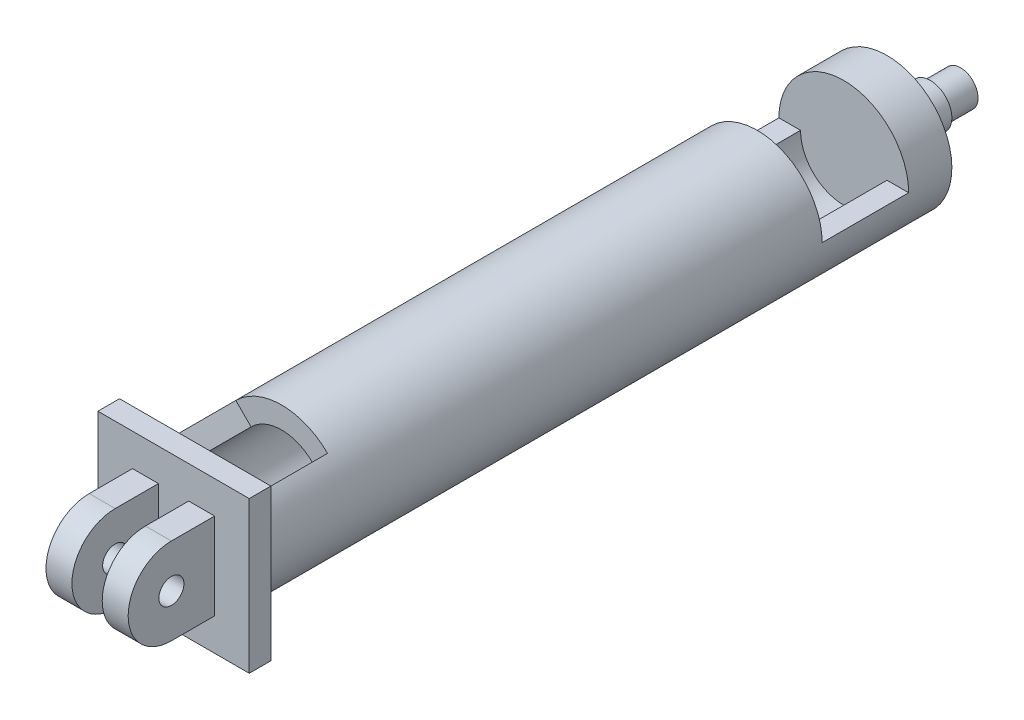
ISO-10303-21;
HEADER;
FILE_DESCRIPTION(('STEP AP214'),'2;1');
FILE_NAME('part.step','',(''),(''),'','','');
FILE_SCHEMA(('AUTOMOTIVE_DESIGN { 1 0 10303 214 1 1 1 1 }'));
ENDSEC;
DATA;
#1=APPLICATION_CONTEXT('core data for automotive mechanical design processes');
#2=APPLICATION_PROTOCOL_DEFINITION('international standard','automotive_design',2000,#1);
#3=PRODUCT_CONTEXT('',#1,'mechanical');
#4=PRODUCT('Part','Part','',(#3));
#5=PRODUCT_RELATED_PRODUCT_CATEGORY('part','',(#4));
#6=PRODUCT_DEFINITION_FORMATION('','',#4);
#7=PRODUCT_DEFINITION_CONTEXT('part definition',#1,'design');
#8=PRODUCT_DEFINITION('design','',#6,#7);
#9=PRODUCT_DEFINITION_SHAPE('','',#8);
#10=(LENGTH_UNIT() NAMED_UNIT(*) SI_UNIT(.MILLI.,.METRE.));
#11=(NAMED_UNIT(*) PLANE_ANGLE_UNIT() SI_UNIT($,.RADIAN.));
#12=(NAMED_UNIT(*) SI_UNIT($,.STERADIAN.) SOLID_ANGLE_UNIT());
#13=UNCERTAINTY_MEASURE_WITH_UNIT(LENGTH_MEASURE(1.E-05),#10,'distance_accuracy_value','');
#14=(GEOMETRIC_REPRESENTATION_CONTEXT(3) GLOBAL_UNCERTAINTY_ASSIGNED_CONTEXT((#13)) GLOBAL_UNIT_ASSIGNED_CONTEXT((#10,
#11,#12)) REPRESENTATION_CONTEXT('',''));
#15=CARTESIAN_POINT('',(0.,0.,0.));
#16=DIRECTION('',(0.,0.,1.));
#17=DIRECTION('',(1.,0.,0.));
#18=AXIS2_PLACEMENT_3D('',#15,#16,#17);
#19=CARTESIAN_POINT('',(17.5,-17.5,155.));
#20=DIRECTION('',(-1.,0.,0.));
#21=DIRECTION('',(0.,0.,1.));
#22=AXIS2_PLACEMENT_3D('',#19,#20,#21);
#23=PLANE('',#22);
#24=DIRECTION('',(0.,0.,-1.));
#25=VECTOR('',#24,1.);
#26=CARTESIAN_POINT('',(17.5,17.5,155.));
#27=LINE('',#26,#25);
#28=CARTESIAN_POINT('',(17.5,17.5,155.));
#29=VERTEX_POINT('',#28);
#30=CARTESIAN_POINT('',(17.5,17.5,150.));
#31=VERTEX_POINT('',#30);
#32=EDGE_CURVE('E487',#29,#31,#27,.T.);
#33=ORIENTED_EDGE('',*,*,#32,.F.);
#34=DIRECTION('',(0.,1.,0.));
#35=VECTOR('',#34,1.);
#36=CARTESIAN_POINT('',(17.5,-17.5,155.));
#37=LINE('',#36,#35);
#38=CARTESIAN_POINT('',(17.5,-17.5,155.));
#39=VERTEX_POINT('',#38);
#40=EDGE_CURVE('E451',#39,#29,#37,.T.);
#41=ORIENTED_EDGE('',*,*,#40,.F.);
#42=DIRECTION('',(0.,0.,-1.));
#43=VECTOR('',#42,1.);
#44=CARTESIAN_POINT('',(17.5,-17.5,155.));
#45=LINE('',#44,#43);
#46=CARTESIAN_POINT('',(17.5,-17.5,150.));
#47=VERTEX_POINT('',#46);
#48=EDGE_CURVE('E464',#39,#47,#45,.T.);
#49=ORIENTED_EDGE('',*,*,#48,.T.);
#50=DIRECTION('',(0.,1.,0.));
#51=VECTOR('',#50,1.);
#52=CARTESIAN_POINT('',(17.5,-17.5,150.));
#53=LINE('',#52,#51);
#54=EDGE_CURVE('E440',#47,#31,#53,.T.);
#55=ORIENTED_EDGE('',*,*,#54,.T.);
#56=EDGE_LOOP('',(#33,#41,#49,#55));
#57=FACE_BOUND('',#56,.T.);
#58=ADVANCED_FACE('F45',(#57),#23,.F.);
#59=CARTESIAN_POINT('',(-17.5,-17.5,155.));
#60=DIRECTION('',(1.,0.,0.));
#61=DIRECTION('',(0.,0.,-1.));
#62=AXIS2_PLACEMENT_3D('',#59,#60,#61);
#63=PLANE('',#62);
#64=DIRECTION('',(0.,0.,-1.));
#65=VECTOR('',#64,1.);
#66=CARTESIAN_POINT('',(-17.5,-17.5,155.));
#67=LINE('',#66,#65);
#68=CARTESIAN_POINT('',(-17.5,-17.5,155.));
#69=VERTEX_POINT('',#68);
#70=CARTESIAN_POINT('',(-17.5,-17.5,150.));
#71=VERTEX_POINT('',#70);
#72=EDGE_CURVE('E479',#69,#71,#67,.T.);
#73=ORIENTED_EDGE('',*,*,#72,.F.);
#74=DIRECTION('',(0.,-1.,0.));
#75=VECTOR('',#74,1.);
#76=CARTESIAN_POINT('',(-17.5,-17.5,155.));
#77=LINE('',#76,#75);
#78=CARTESIAN_POINT('',(-17.5,17.5,155.));
#79=VERTEX_POINT('',#78);
#80=EDGE_CURVE('E458',#79,#69,#77,.T.);
#81=ORIENTED_EDGE('',*,*,#80,.F.);
#82=DIRECTION('',(0.,0.,-1.));
#83=VECTOR('',#82,1.);
#84=CARTESIAN_POINT('',(-17.5,17.5,155.));
#85=LINE('',#84,#83);
#86=CARTESIAN_POINT('',(-17.5,17.5,150.));
#87=VERTEX_POINT('',#86);
#88=EDGE_CURVE('E483',#79,#87,#85,.T.);
#89=ORIENTED_EDGE('',*,*,#88,.T.);
#90=DIRECTION('',(0.,-1.,0.));
#91=VECTOR('',#90,1.);
#92=CARTESIAN_POINT('',(-17.5,-17.5,150.));
#93=LINE('',#92,#91);
#94=EDGE_CURVE('E471',#87,#71,#93,.T.);
#95=ORIENTED_EDGE('',*,*,#94,.T.);
#96=EDGE_LOOP('',(#73,#81,#89,#95));
#97=FACE_BOUND('',#96,.T.);
#98=ADVANCED_FACE('F536',(#97),#63,.F.);
#99=CARTESIAN_POINT('',(45.7842712474619,-10.,155.));
#100=DIRECTION('',(0.,-1.,0.));
#101=DIRECTION('',(0.,0.,-1.));
#102=AXIS2_PLACEMENT_3D('',#99,#100,#101);
#103=PLANE('',#102);
#104=DIRECTION('',(0.,0.,1.));
#105=VECTOR('',#104,1.);
#106=CARTESIAN_POINT('',(-9.5,-10.,155.));
#107=LINE('',#106,#105);
#108=CARTESIAN_POINT('',(-9.5,-10.,155.));
#109=VERTEX_POINT('',#108);
#110=CARTESIAN_POINT('',(-9.5,-10.,165.));
#111=VERTEX_POINT('',#110);
#112=EDGE_CURVE('E344',#109,#111,#107,.T.);
#113=ORIENTED_EDGE('',*,*,#112,.F.);
#114=DIRECTION('',(-1.,0.,0.));
#115=VECTOR('',#114,1.);
#116=CARTESIAN_POINT('',(45.7842712474619,-10.,155.));
#117=LINE('',#116,#115);
#118=CARTESIAN_POINT('',(-3.5,-10.,155.));
#119=VERTEX_POINT('',#118);
#120=EDGE_CURVE('E347',#119,#109,#117,.T.);
#121=ORIENTED_EDGE('',*,*,#120,.F.);
#122=DIRECTION('',(0.,0.,1.));
#123=VECTOR('',#122,1.);
#124=CARTESIAN_POINT('',(-3.5,-10.,155.));
#125=LINE('',#124,#123);
#126=CARTESIAN_POINT('',(-3.49999999999999,-10.,165.));
#127=VERTEX_POINT('',#126);
#128=EDGE_CURVE('E334',#119,#127,#125,.T.);
#129=ORIENTED_EDGE('',*,*,#128,.T.);
#130=DIRECTION('',(-1.,0.,0.));
#131=VECTOR('',#130,1.);
#132=CARTESIAN_POINT('',(45.7842712474619,-10.,165.));
#133=LINE('',#132,#131);
#134=EDGE_CURVE('E359',#127,#111,#133,.T.);
#135=ORIENTED_EDGE('',*,*,#134,.T.);
#136=EDGE_LOOP('',(#113,#121,#129,#135));
#137=FACE_BOUND('',#136,.T.);
#138=ADVANCED_FACE('F543',(#137),#103,.T.);
#139=CARTESIAN_POINT('',(9.5,-10.,165.));
#140=VERTEX_POINT('',#139);
#141=CARTESIAN_POINT('',(3.5,-10.,165.));
#142=VERTEX_POINT('',#141);
#143=EDGE_CURVE('E358',#140,#142,#133,.T.);
#144=ORIENTED_EDGE('',*,*,#143,.T.);
#145=DIRECTION('',(0.,0.,-1.));
#146=VECTOR('',#145,1.);
#147=CARTESIAN_POINT('',(3.5,-10.,155.));
#148=LINE('',#147,#146);
#149=CARTESIAN_POINT('',(3.5,-10.,155.));
#150=VERTEX_POINT('',#149);
#151=EDGE_CURVE('E322',#142,#150,#148,.T.);
#152=ORIENTED_EDGE('',*,*,#151,.T.);
#153=CARTESIAN_POINT('',(9.5,-10.,155.));
#154=VERTEX_POINT('',#153);
#155=EDGE_CURVE('E363',#154,#150,#117,.T.);
#156=ORIENTED_EDGE('',*,*,#155,.F.);
#157=DIRECTION('',(0.,0.,-1.));
#158=VECTOR('',#157,1.);
#159=CARTESIAN_POINT('',(9.5,-10.,155.));
#160=LINE('',#159,#158);
#161=EDGE_CURVE('E310',#140,#154,#160,.T.);
#162=ORIENTED_EDGE('',*,*,#161,.F.);
#163=EDGE_LOOP('',(#144,#152,#156,#162));
#164=FACE_BOUND('',#163,.T.);
#165=ADVANCED_FACE('F604',(#164),#103,.T.);
#166=CARTESIAN_POINT('',(45.7842712474619,0.,165.));
#167=DIRECTION('',(-1.,0.,0.));
#168=DIRECTION('',(0.,0.,1.));
#169=AXIS2_PLACEMENT_3D('',#166,#167,#168);
#170=CYLINDRICAL_SURFACE('',#169,10.);
#171=CARTESIAN_POINT('',(-9.5,0.,165.));
#172=DIRECTION('',(1.,0.,0.));
#173=DIRECTION('',(0.,1.,0.));
#174=AXIS2_PLACEMENT_3D('',#171,#172,#173);
#175=CIRCLE('',#174,10.);
#176=CARTESIAN_POINT('',(-9.5,10.,165.));
#177=VERTEX_POINT('',#176);
#178=EDGE_CURVE('E341',#111,#177,#175,.F.);
#179=ORIENTED_EDGE('',*,*,#178,.F.);
#180=ORIENTED_EDGE('',*,*,#134,.F.);
#181=CARTESIAN_POINT('',(-3.5,0.,165.));
#182=DIRECTION('',(1.,0.,0.));
#183=DIRECTION('',(0.,1.,0.));
#184=AXIS2_PLACEMENT_3D('',#181,#182,#183);
#185=CIRCLE('',#184,10.);
#186=CARTESIAN_POINT('',(-3.5,10.,165.));
#187=VERTEX_POINT('',#186);
#188=EDGE_CURVE('E331',#127,#187,#185,.F.);
#189=ORIENTED_EDGE('',*,*,#188,.T.);
#190=DIRECTION('',(-1.,0.,0.));
#191=VECTOR('',#190,1.);
#192=CARTESIAN_POINT('',(45.7842712474619,10.,165.));
#193=LINE('',#192,#191);
#194=EDGE_CURVE('E354',#187,#177,#193,.T.);
#195=ORIENTED_EDGE('',*,*,#194,.T.);
#196=EDGE_LOOP('',(#179,#180,#189,#195));
#197=FACE_BOUND('',#196,.T.);
#198=ADVANCED_FACE('F777',(#197),#170,.T.);
#199=CARTESIAN_POINT('',(9.5,10.,165.));
#200=VERTEX_POINT('',#199);
#201=CARTESIAN_POINT('',(3.5,10.,165.));
#202=VERTEX_POINT('',#201);
#203=EDGE_CURVE('E353',#200,#202,#193,.T.);
#204=ORIENTED_EDGE('',*,*,#203,.T.);
#205=CARTESIAN_POINT('',(3.5,0.,165.));
#206=DIRECTION('',(-1.,0.,0.));
#207=DIRECTION('',(0.,0.,1.));
#208=AXIS2_PLACEMENT_3D('',#205,#206,#207);
#209=CIRCLE('',#208,10.);
#210=EDGE_CURVE('E318',#202,#142,#209,.F.);
#211=ORIENTED_EDGE('',*,*,#210,.T.);
#212=ORIENTED_EDGE('',*,*,#143,.F.);
#213=CARTESIAN_POINT('',(9.5,0.,165.));
#214=DIRECTION('',(-1.,0.,0.));
#215=DIRECTION('',(0.,0.,1.));
#216=AXIS2_PLACEMENT_3D('',#213,#214,#215);
#217=CIRCLE('',#216,10.);
#218=EDGE_CURVE('E307',#200,#140,#217,.F.);
#219=ORIENTED_EDGE('',*,*,#218,.F.);
#220=EDGE_LOOP('',(#204,#211,#212,#219));
#221=FACE_BOUND('',#220,.T.);
#222=ADVANCED_FACE('F608',(#221),#170,.T.);
#223=CARTESIAN_POINT('',(45.7842712474619,10.,155.));
#224=DIRECTION('',(0.,1.,0.));
#225=DIRECTION('',(0.,0.,1.));
#226=AXIS2_PLACEMENT_3D('',#223,#224,#225);
#227=PLANE('',#226);
#228=DIRECTION('',(0.,0.,-1.));
#229=VECTOR('',#228,1.);
#230=CARTESIAN_POINT('',(-9.5,10.,155.));
#231=LINE('',#230,#229);
#232=CARTESIAN_POINT('',(-9.5,10.,155.));
#233=VERTEX_POINT('',#232);
#234=EDGE_CURVE('E338',#177,#233,#231,.T.);
#235=ORIENTED_EDGE('',*,*,#234,.F.);
#236=ORIENTED_EDGE('',*,*,#194,.F.);
#237=DIRECTION('',(0.,0.,-1.));
#238=VECTOR('',#237,1.);
#239=CARTESIAN_POINT('',(-3.5,10.,155.));
#240=LINE('',#239,#238);
#241=CARTESIAN_POINT('',(-3.5,10.,155.));
#242=VERTEX_POINT('',#241);
#243=EDGE_CURVE('E327',#187,#242,#240,.T.);
#244=ORIENTED_EDGE('',*,*,#243,.T.);
#245=DIRECTION('',(-1.,0.,0.));
#246=VECTOR('',#245,1.);
#247=CARTESIAN_POINT('',(45.7842712474619,10.,155.));
#248=LINE('',#247,#246);
#249=EDGE_CURVE('E348',#242,#233,#248,.T.);
#250=ORIENTED_EDGE('',*,*,#249,.T.);
#251=EDGE_LOOP('',(#235,#236,#244,#250));
#252=FACE_BOUND('',#251,.T.);
#253=ADVANCED_FACE('F793',(#252),#227,.T.);
#254=CARTESIAN_POINT('',(9.5,10.,155.));
#255=VERTEX_POINT('',#254);
#256=CARTESIAN_POINT('',(3.5,10.,155.));
#257=VERTEX_POINT('',#256);
#258=EDGE_CURVE('E352',#255,#257,#248,.T.);
#259=ORIENTED_EDGE('',*,*,#258,.T.);
#260=DIRECTION('',(0.,0.,1.));
#261=VECTOR('',#260,1.);
#262=CARTESIAN_POINT('',(3.5,10.,155.));
#263=LINE('',#262,#261);
#264=EDGE_CURVE('E314',#257,#202,#263,.T.);
#265=ORIENTED_EDGE('',*,*,#264,.T.);
#266=ORIENTED_EDGE('',*,*,#203,.F.);
#267=DIRECTION('',(0.,0.,1.));
#268=VECTOR('',#267,1.);
#269=CARTESIAN_POINT('',(9.5,10.,155.));
#270=LINE('',#269,#268);
#271=EDGE_CURVE('E303',#255,#200,#270,.T.);
#272=ORIENTED_EDGE('',*,*,#271,.F.);
#273=EDGE_LOOP('',(#259,#265,#266,#272));
#274=FACE_BOUND('',#273,.T.);
#275=ADVANCED_FACE('F560',(#274),#227,.T.);
#276=CARTESIAN_POINT('',(0.,0.,150.));
#277=DIRECTION('',(0.,0.,-1.));
#278=DIRECTION('',(-1.,0.,0.));
#279=AXIS2_PLACEMENT_3D('',#276,#277,#278);
#280=CYLINDRICAL_SURFACE('',#279,15.);
#281=DIRECTION('',(0.,0.,1.));
#282=VECTOR('',#281,1.);
#283=CARTESIAN_POINT('',(8.60364654526571,-12.2872806643349,37.));
#284=LINE('',#283,#282);
#285=CARTESIAN_POINT('',(8.60364654526571,-12.2872806643349,37.));
#286=VERTEX_POINT('',#285);
#287=CARTESIAN_POINT('',(8.60364654526571,-12.2872806643349,40.));
#288=VERTEX_POINT('',#287);
#289=EDGE_CURVE('E236',#286,#288,#284,.T.);
#290=ORIENTED_EDGE('',*,*,#289,.F.);
#291=CARTESIAN_POINT('',(0.,0.,37.));
#292=DIRECTION('',(0.,0.,-1.));
#293=DIRECTION('',(-1.,0.,0.));
#294=AXIS2_PLACEMENT_3D('',#291,#292,#293);
#295=CIRCLE('',#294,15.);
#296=CARTESIAN_POINT('',(1.5,-14.9248115565993,37.));
#297=VERTEX_POINT('',#296);
#298=EDGE_CURVE('E242',#286,#297,#295,.T.);
#299=ORIENTED_EDGE('',*,*,#298,.T.);
#300=DIRECTION('',(0.,0.,-1.));
#301=VECTOR('',#300,1.);
#302=CARTESIAN_POINT('',(1.5,-14.9248115565993,40.));
#303=LINE('',#302,#301);
#304=CARTESIAN_POINT('',(1.5,-14.9248115565993,-10.));
#305=VERTEX_POINT('',#304);
#306=EDGE_CURVE('E286',#297,#305,#303,.T.);
#307=ORIENTED_EDGE('',*,*,#306,.T.);
#308=CARTESIAN_POINT('',(0.,0.,-10.));
#309=DIRECTION('',(0.,0.,-1.));
#310=DIRECTION('',(-1.,0.,0.));
#311=AXIS2_PLACEMENT_3D('',#308,#309,#310);
#312=CIRCLE('',#311,15.);
#313=CARTESIAN_POINT('',(-1.5,-14.9248115565993,-10.));
#314=VERTEX_POINT('',#313);
#315=EDGE_CURVE('E412',#314,#305,#312,.T.);
#316=ORIENTED_EDGE('',*,*,#315,.F.);
#317=DIRECTION('',(0.,0.,-1.));
#318=VECTOR('',#317,1.);
#319=CARTESIAN_POINT('',(-1.5,-14.9248115565993,40.));
#320=LINE('',#319,#318);
#321=CARTESIAN_POINT('',(-1.5,-14.9248115565993,40.));
#322=VERTEX_POINT('',#321);
#323=EDGE_CURVE('E283',#322,#314,#320,.T.);
#324=ORIENTED_EDGE('',*,*,#323,.F.);
#325=CARTESIAN_POINT('',(0.,0.,40.));
#326=DIRECTION('',(0.,0.,-1.));
#327=DIRECTION('',(-1.,0.,0.));
#328=AXIS2_PLACEMENT_3D('',#325,#326,#327);
#329=CIRCLE('',#328,15.);
#330=EDGE_CURVE('E262',#288,#322,#329,.T.);
#331=ORIENTED_EDGE('',*,*,#330,.F.);
#332=EDGE_LOOP('',(#290,#299,#307,#316,#324,#331));
#333=FACE_BOUND('',#332,.T.);
#334=CARTESIAN_POINT('',(0.,0.,130.));
#335=DIRECTION('',(0.,0.,-1.));
#336=DIRECTION('',(-1.,0.,0.));
#337=AXIS2_PLACEMENT_3D('',#334,#335,#336);
#338=CIRCLE('',#337,15.);
#339=CARTESIAN_POINT('',(10.6066017177983,10.6066017177982,130.));
#340=VERTEX_POINT('',#339);
#341=CARTESIAN_POINT('',(-10.6066017177982,10.6066017177982,130.));
#342=VERTEX_POINT('',#341);
#343=EDGE_CURVE('E378',#340,#342,#338,.F.);
#344=ORIENTED_EDGE('',*,*,#343,.F.);
#345=DIRECTION('',(0.,0.,1.));
#346=VECTOR('',#345,1.);
#347=CARTESIAN_POINT('',(10.6066017177983,10.6066017177982,130.));
#348=LINE('',#347,#346);
#349=CARTESIAN_POINT('',(10.6066017177983,10.6066017177982,150.));
#350=VERTEX_POINT('',#349);
#351=EDGE_CURVE('E382',#340,#350,#348,.T.);
#352=ORIENTED_EDGE('',*,*,#351,.T.);
#353=CARTESIAN_POINT('',(0.,0.,150.));
#354=DIRECTION('',(0.,0.,1.));
#355=DIRECTION('',(1.,0.,0.));
#356=AXIS2_PLACEMENT_3D('',#353,#354,#355);
#357=CIRCLE('',#356,15.);
#358=CARTESIAN_POINT('',(-10.6066017177982,10.6066017177982,150.));
#359=VERTEX_POINT('',#358);
#360=EDGE_CURVE('E411',#359,#350,#357,.T.);
#361=ORIENTED_EDGE('',*,*,#360,.F.);
#362=DIRECTION('',(0.,0.,1.));
#363=VECTOR('',#362,1.);
#364=CARTESIAN_POINT('',(-10.6066017177982,10.6066017177982,130.));
#365=LINE('',#364,#363);
#366=EDGE_CURVE('E391',#342,#359,#365,.T.);
#367=ORIENTED_EDGE('',*,*,#366,.F.);
#368=EDGE_LOOP('',(#344,#352,#361,#367));
#369=FACE_BOUND('',#368,.T.);
#370=DIRECTION('',(0.,0.,-1.));
#371=VECTOR('',#370,1.);
#372=CARTESIAN_POINT('',(-15.,0.,20.));
#373=LINE('',#372,#371);
#374=CARTESIAN_POINT('',(-15.,0.,20.));
#375=VERTEX_POINT('',#374);
#376=CARTESIAN_POINT('',(-15.,0.,0.));
#377=VERTEX_POINT('',#376);
#378=EDGE_CURVE('E433',#375,#377,#373,.T.);
#379=ORIENTED_EDGE('',*,*,#378,.T.);
#380=CARTESIAN_POINT('',(0.,0.,0.));
#381=DIRECTION('',(0.,0.,-1.));
#382=DIRECTION('',(-1.,0.,0.));
#383=AXIS2_PLACEMENT_3D('',#380,#381,#382);
#384=CIRCLE('',#383,15.);
#385=CARTESIAN_POINT('',(15.,0.,0.));
#386=VERTEX_POINT('',#385);
#387=EDGE_CURVE('E406',#377,#386,#384,.T.);
#388=ORIENTED_EDGE('',*,*,#387,.T.);
#389=DIRECTION('',(0.,0.,-1.));
#390=VECTOR('',#389,1.);
#391=CARTESIAN_POINT('',(15.,0.,20.));
#392=LINE('',#391,#390);
#393=CARTESIAN_POINT('',(15.,0.,20.));
#394=VERTEX_POINT('',#393);
#395=EDGE_CURVE('E445',#394,#386,#392,.T.);
#396=ORIENTED_EDGE('',*,*,#395,.F.);
#397=CARTESIAN_POINT('',(0.,0.,20.));
#398=DIRECTION('',(0.,0.,-1.));
#399=DIRECTION('',(-1.,0.,0.));
#400=AXIS2_PLACEMENT_3D('',#397,#398,#399);
#401=CIRCLE('',#400,15.);
#402=EDGE_CURVE('E423',#375,#394,#401,.T.);
#403=ORIENTED_EDGE('',*,*,#402,.F.);
#404=EDGE_LOOP('',(#379,#388,#396,#403));
#405=FACE_BOUND('',#404,.T.);
#406=ADVANCED_FACE('F47',(#333,#369,#405),#280,.T.);
#407=CARTESIAN_POINT('',(0.,0.,150.));
#408=DIRECTION('',(0.,0.,-1.));
#409=DIRECTION('',(-1.,0.,0.));
#410=AXIS2_PLACEMENT_3D('',#407,#408,#409);
#411=CYLINDRICAL_SURFACE('',#410,10.);
#412=DIRECTION('',(0.,0.,-1.));
#413=VECTOR('',#412,1.);
#414=CARTESIAN_POINT('',(7.07106781186551,7.07106781186544,150.));
#415=LINE('',#414,#413);
#416=CARTESIAN_POINT('',(7.07106781186551,7.07106781186544,130.));
#417=VERTEX_POINT('',#416);
#418=CARTESIAN_POINT('',(7.07106781186551,7.07106781186544,150.));
#419=VERTEX_POINT('',#418);
#420=EDGE_CURVE('E398',#417,#419,#415,.F.);
#421=ORIENTED_EDGE('',*,*,#420,.F.);
#422=CARTESIAN_POINT('',(0.,0.,130.));
#423=DIRECTION('',(0.,0.,-1.));
#424=DIRECTION('',(-1.,0.,0.));
#425=AXIS2_PLACEMENT_3D('',#422,#423,#424);
#426=CIRCLE('',#425,10.);
#427=CARTESIAN_POINT('',(-7.07106781186546,7.07106781186549,130.));
#428=VERTEX_POINT('',#427);
#429=EDGE_CURVE('E55',#428,#417,#426,.T.);
#430=ORIENTED_EDGE('',*,*,#429,.F.);
#431=DIRECTION('',(0.,0.,-1.));
#432=VECTOR('',#431,1.);
#433=CARTESIAN_POINT('',(-7.07106781186546,7.07106781186549,150.));
#434=LINE('',#433,#432);
#435=CARTESIAN_POINT('',(-7.07106781186546,7.07106781186549,150.));
#436=VERTEX_POINT('',#435);
#437=EDGE_CURVE('E394',#428,#436,#434,.F.);
#438=ORIENTED_EDGE('',*,*,#437,.T.);
#439=CARTESIAN_POINT('',(0.,0.,150.));
#440=DIRECTION('',(0.,0.,1.));
#441=DIRECTION('',(1.,0.,0.));
#442=AXIS2_PLACEMENT_3D('',#439,#440,#441);
#443=CIRCLE('',#442,10.);
#444=EDGE_CURVE('E491',#436,#419,#443,.T.);
#445=ORIENTED_EDGE('',*,*,#444,.T.);
#446=EDGE_LOOP('',(#421,#430,#438,#445));
#447=FACE_BOUND('',#446,.T.);
#448=CARTESIAN_POINT('',(0.,0.,0.));
#449=DIRECTION('',(0.,0.,1.));
#450=DIRECTION('',(1.,0.,0.));
#451=AXIS2_PLACEMENT_3D('',#448,#449,#450);
#452=CIRCLE('',#451,10.);
#453=CARTESIAN_POINT('',(-10.,0.,0.));
#454=VERTEX_POINT('',#453);
#455=CARTESIAN_POINT('',(10.,0.,0.));
#456=VERTEX_POINT('',#455);
#457=EDGE_CURVE('E495',#454,#456,#452,.T.);
#458=ORIENTED_EDGE('',*,*,#457,.F.);
#459=DIRECTION('',(0.,0.,-1.));
#460=VECTOR('',#459,1.);
#461=CARTESIAN_POINT('',(-10.,0.,20.));
#462=LINE('',#461,#460);
#463=CARTESIAN_POINT('',(-10.,0.,20.));
#464=VERTEX_POINT('',#463);
#465=EDGE_CURVE('E437',#464,#454,#462,.T.);
#466=ORIENTED_EDGE('',*,*,#465,.F.);
#467=CARTESIAN_POINT('',(0.,0.,20.));
#468=DIRECTION('',(0.,0.,-1.));
#469=DIRECTION('',(-1.,0.,0.));
#470=AXIS2_PLACEMENT_3D('',#467,#468,#469);
#471=CIRCLE('',#470,10.);
#472=CARTESIAN_POINT('',(10.,0.,20.));
#473=VERTEX_POINT('',#472);
#474=EDGE_CURVE('E429',#473,#464,#471,.F.);
#475=ORIENTED_EDGE('',*,*,#474,.F.);
#476=DIRECTION('',(0.,0.,-1.));
#477=VECTOR('',#476,1.);
#478=CARTESIAN_POINT('',(10.,0.,20.));
#479=LINE('',#478,#477);
#480=EDGE_CURVE('E441',#473,#456,#479,.T.);
#481=ORIENTED_EDGE('',*,*,#480,.T.);
#482=EDGE_LOOP('',(#458,#466,#475,#481));
#483=FACE_BOUND('',#482,.T.);
#484=ADVANCED_FACE('F549',(#447,#483),#411,.F.);
#485=CARTESIAN_POINT('',(0.,0.,150.));
#486=DIRECTION('',(0.,0.,-1.));
#487=DIRECTION('',(-1.,0.,0.));
#488=AXIS2_PLACEMENT_3D('',#485,#486,#487);
#489=PLANE('',#488);
#490=ORIENTED_EDGE('',*,*,#444,.F.);
#491=DIRECTION('',(-0.707106781186546,0.707106781186549,0.));
#492=VECTOR('',#491,1.);
#493=CARTESIAN_POINT('',(0.,0.,150.));
#494=LINE('',#493,#492);
#495=EDGE_CURVE('E375',#436,#359,#494,.T.);
#496=ORIENTED_EDGE('',*,*,#495,.T.);
#497=ORIENTED_EDGE('',*,*,#360,.T.);
#498=DIRECTION('',(0.707106781186551,0.707106781186544,0.));
#499=VECTOR('',#498,1.);
#500=CARTESIAN_POINT('',(0.,0.,150.));
#501=LINE('',#500,#499);
#502=EDGE_CURVE('E369',#419,#350,#501,.T.);
#503=ORIENTED_EDGE('',*,*,#502,.F.);
#504=EDGE_LOOP('',(#490,#496,#497,#503));
#505=FACE_BOUND('',#504,.T.);
#506=ORIENTED_EDGE('',*,*,#54,.F.);
#507=DIRECTION('',(1.,0.,0.));
#508=VECTOR('',#507,1.);
#509=CARTESIAN_POINT('',(-17.5,-17.5,150.));
#510=LINE('',#509,#508);
#511=EDGE_CURVE('E455',#71,#47,#510,.T.);
#512=ORIENTED_EDGE('',*,*,#511,.F.);
#513=ORIENTED_EDGE('',*,*,#94,.F.);
#514=DIRECTION('',(-1.,0.,0.));
#515=VECTOR('',#514,1.);
#516=CARTESIAN_POINT('',(-17.5,17.5,150.));
#517=LINE('',#516,#515);
#518=EDGE_CURVE('E468',#31,#87,#517,.T.);
#519=ORIENTED_EDGE('',*,*,#518,.F.);
#520=EDGE_LOOP('',(#506,#512,#513,#519));
#521=FACE_BOUND('',#520,.T.);
#522=ADVANCED_FACE('F551',(#505,#521),#489,.T.);
#523=CARTESIAN_POINT('',(-17.5,17.5,155.));
#524=DIRECTION('',(0.,-1.,0.));
#525=DIRECTION('',(0.,0.,-1.));
#526=AXIS2_PLACEMENT_3D('',#523,#524,#525);
#527=PLANE('',#526);
#528=ORIENTED_EDGE('',*,*,#518,.T.);
#529=ORIENTED_EDGE('',*,*,#88,.F.);
#530=DIRECTION('',(-1.,0.,0.));
#531=VECTOR('',#530,1.);
#532=CARTESIAN_POINT('',(-17.5,17.5,155.));
#533=LINE('',#532,#531);
#534=EDGE_CURVE('E454',#29,#79,#533,.T.);
#535=ORIENTED_EDGE('',*,*,#534,.F.);
#536=ORIENTED_EDGE('',*,*,#32,.T.);
#537=EDGE_LOOP('',(#528,#529,#535,#536));
#538=FACE_BOUND('',#537,.T.);
#539=ADVANCED_FACE('F548',(#538),#527,.F.);
#540=CARTESIAN_POINT('',(-17.5,-17.5,155.));
#541=DIRECTION('',(0.,1.,0.));
#542=DIRECTION('',(0.,0.,1.));
#543=AXIS2_PLACEMENT_3D('',#540,#541,#542);
#544=PLANE('',#543);
#545=ORIENTED_EDGE('',*,*,#511,.T.);
#546=ORIENTED_EDGE('',*,*,#48,.F.);
#547=DIRECTION('',(1.,0.,0.));
#548=VECTOR('',#547,1.);
#549=CARTESIAN_POINT('',(-17.5,-17.5,155.));
#550=LINE('',#549,#548);
#551=EDGE_CURVE('E461',#69,#39,#550,.T.);
#552=ORIENTED_EDGE('',*,*,#551,.F.);
#553=ORIENTED_EDGE('',*,*,#72,.T.);
#554=EDGE_LOOP('',(#545,#546,#552,#553));
#555=FACE_BOUND('',#554,.T.);
#556=ADVANCED_FACE('F741',(#555),#544,.F.);
#557=CARTESIAN_POINT('',(0.,0.,155.));
#558=DIRECTION('',(0.,0.,-1.));
#559=DIRECTION('',(-1.,0.,0.));
#560=AXIS2_PLACEMENT_3D('',#557,#558,#559);
#561=PLANE('',#560);
#562=DIRECTION('',(0.,-1.,0.));
#563=VECTOR('',#562,1.);
#564=CARTESIAN_POINT('',(-9.5,0.,155.));
#565=LINE('',#564,#563);
#566=EDGE_CURVE('E71',#233,#109,#565,.T.);
#567=ORIENTED_EDGE('',*,*,#566,.F.);
#568=ORIENTED_EDGE('',*,*,#249,.F.);
#569=DIRECTION('',(0.,-1.,0.));
#570=VECTOR('',#569,1.);
#571=CARTESIAN_POINT('',(-3.5,0.,155.));
#572=LINE('',#571,#570);
#573=EDGE_CURVE('E295',#242,#119,#572,.T.);
#574=ORIENTED_EDGE('',*,*,#573,.T.);
#575=ORIENTED_EDGE('',*,*,#120,.T.);
#576=EDGE_LOOP('',(#567,#568,#574,#575));
#577=FACE_BOUND('',#576,.T.);
#578=ORIENTED_EDGE('',*,*,#534,.T.);
#579=ORIENTED_EDGE('',*,*,#80,.T.);
#580=ORIENTED_EDGE('',*,*,#551,.T.);
#581=ORIENTED_EDGE('',*,*,#40,.T.);
#582=EDGE_LOOP('',(#578,#579,#580,#581));
#583=FACE_BOUND('',#582,.T.);
#584=DIRECTION('',(0.,1.,0.));
#585=VECTOR('',#584,1.);
#586=CARTESIAN_POINT('',(3.5,0.,155.));
#587=LINE('',#586,#585);
#588=EDGE_CURVE('E294',#150,#257,#587,.T.);
#589=ORIENTED_EDGE('',*,*,#588,.T.);
#590=ORIENTED_EDGE('',*,*,#258,.F.);
#591=DIRECTION('',(0.,1.,0.));
#592=VECTOR('',#591,1.);
#593=CARTESIAN_POINT('',(9.5,0.,155.));
#594=LINE('',#593,#592);
#595=EDGE_CURVE('E282',#154,#255,#594,.T.);
#596=ORIENTED_EDGE('',*,*,#595,.F.);
#597=ORIENTED_EDGE('',*,*,#155,.T.);
#598=EDGE_LOOP('',(#589,#590,#596,#597));
#599=FACE_BOUND('',#598,.T.);
#600=ADVANCED_FACE('F599',(#577,#583,#599),#561,.F.);
#601=CARTESIAN_POINT('',(0.,0.,20.));
#602=DIRECTION('',(0.,1.,0.));
#603=DIRECTION('',(0.,0.,1.));
#604=AXIS2_PLACEMENT_3D('',#601,#602,#603);
#605=PLANE('',#604);
#606=DIRECTION('',(1.,0.,0.));
#607=VECTOR('',#606,1.);
#608=CARTESIAN_POINT('',(0.,0.,0.));
#609=LINE('',#608,#607);
#610=EDGE_CURVE('E416',#377,#454,#609,.T.);
#611=ORIENTED_EDGE('',*,*,#610,.F.);
#612=ORIENTED_EDGE('',*,*,#378,.F.);
#613=DIRECTION('',(1.,0.,0.));
#614=VECTOR('',#613,1.);
#615=CARTESIAN_POINT('',(0.,0.,20.));
#616=LINE('',#615,#614);
#617=EDGE_CURVE('E420',#375,#464,#616,.T.);
#618=ORIENTED_EDGE('',*,*,#617,.T.);
#619=ORIENTED_EDGE('',*,*,#465,.T.);
#620=EDGE_LOOP('',(#611,#612,#618,#619));
#621=FACE_BOUND('',#620,.T.);
#622=ADVANCED_FACE('F574',(#621),#605,.T.);
#623=EDGE_CURVE('E424',#456,#386,#609,.T.);
#624=ORIENTED_EDGE('',*,*,#623,.F.);
#625=ORIENTED_EDGE('',*,*,#480,.F.);
#626=EDGE_CURVE('E425',#473,#394,#616,.T.);
#627=ORIENTED_EDGE('',*,*,#626,.T.);
#628=ORIENTED_EDGE('',*,*,#395,.T.);
#629=EDGE_LOOP('',(#624,#625,#627,#628));
#630=FACE_BOUND('',#629,.T.);
#631=ADVANCED_FACE('F583',(#630),#605,.T.);
#632=CARTESIAN_POINT('',(0.,0.,20.));
#633=DIRECTION('',(0.,0.,-1.));
#634=DIRECTION('',(-1.,0.,0.));
#635=AXIS2_PLACEMENT_3D('',#632,#633,#634);
#636=PLANE('',#635);
#637=ORIENTED_EDGE('',*,*,#617,.F.);
#638=ORIENTED_EDGE('',*,*,#402,.T.);
#639=ORIENTED_EDGE('',*,*,#626,.F.);
#640=ORIENTED_EDGE('',*,*,#474,.T.);
#641=EDGE_LOOP('',(#637,#638,#639,#640));
#642=FACE_BOUND('',#641,.T.);
#643=ADVANCED_FACE('F580',(#642),#636,.T.);
#644=CARTESIAN_POINT('',(0.,0.,0.));
#645=DIRECTION('',(0.,0.,-1.));
#646=DIRECTION('',(-1.,0.,0.));
#647=AXIS2_PLACEMENT_3D('',#644,#645,#646);
#648=PLANE('',#647);
#649=ORIENTED_EDGE('',*,*,#387,.F.);
#650=ORIENTED_EDGE('',*,*,#610,.T.);
#651=ORIENTED_EDGE('',*,*,#457,.T.);
#652=ORIENTED_EDGE('',*,*,#623,.T.);
#653=EDGE_LOOP('',(#649,#650,#651,#652));
#654=FACE_BOUND('',#653,.T.);
#655=ADVANCED_FACE('F572',(#654),#648,.F.);
#656=CARTESIAN_POINT('',(0.,0.,-10.));
#657=DIRECTION('',(0.,0.,-1.));
#658=DIRECTION('',(-1.,0.,0.));
#659=AXIS2_PLACEMENT_3D('',#656,#657,#658);
#660=PLANE('',#659);
#661=DIRECTION('',(0.,1.,0.));
#662=VECTOR('',#661,1.);
#663=CARTESIAN_POINT('',(-1.5,0.,-10.));
#664=LINE('',#663,#662);
#665=CARTESIAN_POINT('',(-1.5,-13.4164078649987,-10.));
#666=VERTEX_POINT('',#665);
#667=EDGE_CURVE('E263',#314,#666,#664,.T.);
#668=ORIENTED_EDGE('',*,*,#667,.F.);
#669=ORIENTED_EDGE('',*,*,#315,.T.);
#670=DIRECTION('',(0.,-1.,0.));
#671=VECTOR('',#670,1.);
#672=CARTESIAN_POINT('',(1.5,0.,-10.));
#673=LINE('',#672,#671);
#674=CARTESIAN_POINT('',(1.5,-13.4164078649987,-10.));
#675=VERTEX_POINT('',#674);
#676=EDGE_CURVE('E273',#675,#305,#673,.T.);
#677=ORIENTED_EDGE('',*,*,#676,.F.);
#678=CARTESIAN_POINT('',(0.,0.,-10.));
#679=DIRECTION('',(0.,0.,-1.));
#680=DIRECTION('',(-1.,0.,0.));
#681=AXIS2_PLACEMENT_3D('',#678,#679,#680);
#682=CIRCLE('',#681,13.5);
#683=EDGE_CURVE('E235',#675,#666,#682,.T.);
#684=ORIENTED_EDGE('',*,*,#683,.T.);
#685=EDGE_LOOP('',(#668,#669,#677,#684));
#686=FACE_BOUND('',#685,.T.);
#687=CARTESIAN_POINT('',(0.,0.,-10.));
#688=DIRECTION('',(0.,0.,-1.));
#689=DIRECTION('',(-1.,0.,0.));
#690=AXIS2_PLACEMENT_3D('',#687,#688,#689);
#691=CIRCLE('',#690,5.);
#692=CARTESIAN_POINT('',(-5.,0.,-10.));
#693=VERTEX_POINT('',#692);
#694=EDGE_CURVE('E407',#693,#693,#691,.T.);
#695=ORIENTED_EDGE('',*,*,#694,.F.);
#696=EDGE_LOOP('',(#695));
#697=FACE_BOUND('',#696,.T.);
#698=ADVANCED_FACE('F685',(#686,#697),#660,.T.);
#699=CARTESIAN_POINT('',(0.,0.,-20.));
#700=DIRECTION('',(0.,0.,1.));
#701=DIRECTION('',(1.,0.,0.));
#702=AXIS2_PLACEMENT_3D('',#699,#700,#701);
#703=CYLINDRICAL_SURFACE('',#702,5.);
#704=CARTESIAN_POINT('',(0.,0.,-20.));
#705=DIRECTION('',(0.,0.,-1.));
#706=DIRECTION('',(-1.,0.,0.));
#707=AXIS2_PLACEMENT_3D('',#704,#705,#706);
#708=CIRCLE('',#707,5.);
#709=CARTESIAN_POINT('',(-5.,0.,-20.));
#710=VERTEX_POINT('',#709);
#711=EDGE_CURVE('E402',#710,#710,#708,.T.);
#712=ORIENTED_EDGE('',*,*,#711,.F.);
#713=EDGE_LOOP('',(#712));
#714=FACE_BOUND('',#713,.T.);
#715=ORIENTED_EDGE('',*,*,#694,.T.);
#716=EDGE_LOOP('',(#715));
#717=FACE_BOUND('',#716,.T.);
#718=ADVANCED_FACE('F688',(#714,#717),#703,.T.);
#719=CARTESIAN_POINT('',(0.,0.,-20.));
#720=DIRECTION('',(0.,0.,-1.));
#721=DIRECTION('',(-1.,0.,0.));
#722=AXIS2_PLACEMENT_3D('',#719,#720,#721);
#723=PLANE('',#722);
#724=CARTESIAN_POINT('',(0.,0.,-20.));
#725=DIRECTION('',(0.,0.,-1.));
#726=DIRECTION('',(-1.,0.,0.));
#727=AXIS2_PLACEMENT_3D('',#724,#725,#726);
#728=CIRCLE('',#727,4.05);
#729=CARTESIAN_POINT('',(-4.05,0.,-20.));
#730=VERTEX_POINT('',#729);
#731=EDGE_CURVE('E11',#730,#730,#728,.T.);
#732=ORIENTED_EDGE('',*,*,#731,.F.);
#733=EDGE_LOOP('',(#732));
#734=FACE_BOUND('',#733,.T.);
#735=ORIENTED_EDGE('',*,*,#711,.T.);
#736=EDGE_LOOP('',(#735));
#737=FACE_BOUND('',#736,.T.);
#738=ADVANCED_FACE('F859',(#734,#737),#723,.T.);
#739=CARTESIAN_POINT('',(0.,0.,130.));
#740=DIRECTION('',(0.707106781186544,-0.707106781186551,0.));
#741=DIRECTION('',(0.707106781186551,0.707106781186544,0.));
#742=AXIS2_PLACEMENT_3D('',#739,#740,#741);
#743=PLANE('',#742);
#744=ORIENTED_EDGE('',*,*,#420,.T.);
#745=ORIENTED_EDGE('',*,*,#502,.T.);
#746=ORIENTED_EDGE('',*,*,#351,.F.);
#747=DIRECTION('',(0.707106781186551,0.707106781186544,0.));
#748=VECTOR('',#747,1.);
#749=CARTESIAN_POINT('',(0.,0.,130.));
#750=LINE('',#749,#748);
#751=EDGE_CURVE('E371',#417,#340,#750,.T.);
#752=ORIENTED_EDGE('',*,*,#751,.F.);
#753=EDGE_LOOP('',(#744,#745,#746,#752));
#754=FACE_BOUND('',#753,.T.);
#755=ADVANCED_FACE('F849',(#754),#743,.F.);
#756=CARTESIAN_POINT('',(0.,0.,130.));
#757=DIRECTION('',(0.707106781186549,0.707106781186546,0.));
#758=DIRECTION('',(-0.707106781186546,0.707106781186549,0.));
#759=AXIS2_PLACEMENT_3D('',#756,#757,#758);
#760=PLANE('',#759);
#761=DIRECTION('',(-0.707106781186546,0.707106781186549,0.));
#762=VECTOR('',#761,1.);
#763=CARTESIAN_POINT('',(0.,0.,130.));
#764=LINE('',#763,#762);
#765=EDGE_CURVE('E374',#428,#342,#764,.T.);
#766=ORIENTED_EDGE('',*,*,#765,.T.);
#767=ORIENTED_EDGE('',*,*,#366,.T.);
#768=ORIENTED_EDGE('',*,*,#495,.F.);
#769=ORIENTED_EDGE('',*,*,#437,.F.);
#770=EDGE_LOOP('',(#766,#767,#768,#769));
#771=FACE_BOUND('',#770,.T.);
#772=ADVANCED_FACE('F839',(#771),#760,.T.);
#773=CARTESIAN_POINT('',(0.,0.,130.));
#774=DIRECTION('',(0.,0.,-1.));
#775=DIRECTION('',(-1.,0.,0.));
#776=AXIS2_PLACEMENT_3D('',#773,#774,#775);
#777=PLANE('',#776);
#778=ORIENTED_EDGE('',*,*,#429,.T.);
#779=ORIENTED_EDGE('',*,*,#751,.T.);
#780=ORIENTED_EDGE('',*,*,#343,.T.);
#781=ORIENTED_EDGE('',*,*,#765,.F.);
#782=EDGE_LOOP('',(#778,#779,#780,#781));
#783=FACE_BOUND('',#782,.T.);
#784=ADVANCED_FACE('F828',(#783),#777,.F.);
#785=CARTESIAN_POINT('',(0.,0.,-27.));
#786=DIRECTION('',(0.,0.,1.));
#787=DIRECTION('',(1.,0.,0.));
#788=AXIS2_PLACEMENT_3D('',#785,#786,#787);
#789=CYLINDRICAL_SURFACE('',#788,4.05);
#790=CARTESIAN_POINT('',(0.,0.,-27.));
#791=DIRECTION('',(0.,0.,-1.));
#792=DIRECTION('',(-1.,0.,0.));
#793=AXIS2_PLACEMENT_3D('',#790,#791,#792);
#794=CIRCLE('',#793,4.05);
#795=CARTESIAN_POINT('',(-4.05,0.,-27.));
#796=VERTEX_POINT('',#795);
#797=EDGE_CURVE('E366',#796,#796,#794,.T.);
#798=ORIENTED_EDGE('',*,*,#797,.F.);
#799=EDGE_LOOP('',(#798));
#800=FACE_BOUND('',#799,.T.);
#801=ORIENTED_EDGE('',*,*,#731,.T.);
#802=EDGE_LOOP('',(#801));
#803=FACE_BOUND('',#802,.T.);
#804=ADVANCED_FACE('F626',(#800,#803),#789,.T.);
#805=CARTESIAN_POINT('',(0.,0.,-27.));
#806=DIRECTION('',(0.,0.,-1.));
#807=DIRECTION('',(-1.,0.,0.));
#808=AXIS2_PLACEMENT_3D('',#805,#806,#807);
#809=PLANE('',#808);
#810=ORIENTED_EDGE('',*,*,#797,.T.);
#811=EDGE_LOOP('',(#810));
#812=FACE_BOUND('',#811,.T.);
#813=ADVANCED_FACE('F616',(#812),#809,.T.);
#814=CARTESIAN_POINT('',(9.5,0.,175.));
#815=DIRECTION('',(-1.,0.,0.));
#816=DIRECTION('',(0.,0.,1.));
#817=AXIS2_PLACEMENT_3D('',#814,#815,#816);
#818=PLANE('',#817);
#819=ORIENTED_EDGE('',*,*,#161,.T.);
#820=ORIENTED_EDGE('',*,*,#595,.T.);
#821=ORIENTED_EDGE('',*,*,#271,.T.);
#822=ORIENTED_EDGE('',*,*,#218,.T.);
#823=EDGE_LOOP('',(#819,#820,#821,#822));
#824=FACE_BOUND('',#823,.T.);
#825=CARTESIAN_POINT('',(9.5,0.,165.));
#826=DIRECTION('',(-1.,0.,0.));
#827=DIRECTION('',(0.,0.,1.));
#828=AXIS2_PLACEMENT_3D('',#825,#826,#827);
#829=CIRCLE('',#828,2.9);
#830=CARTESIAN_POINT('',(9.5,0.,167.9));
#831=VERTEX_POINT('',#830);
#832=EDGE_CURVE('E293',#831,#831,#829,.F.);
#833=ORIENTED_EDGE('',*,*,#832,.F.);
#834=EDGE_LOOP('',(#833));
#835=FACE_BOUND('',#834,.T.);
#836=ADVANCED_FACE('F613',(#824,#835),#818,.F.);
#837=CARTESIAN_POINT('',(-3.5,0.,175.));
#838=DIRECTION('',(1.,0.,0.));
#839=DIRECTION('',(0.,1.,0.));
#840=AXIS2_PLACEMENT_3D('',#837,#838,#839);
#841=PLANE('',#840);
#842=ORIENTED_EDGE('',*,*,#573,.F.);
#843=ORIENTED_EDGE('',*,*,#243,.F.);
#844=ORIENTED_EDGE('',*,*,#188,.F.);
#845=ORIENTED_EDGE('',*,*,#128,.F.);
#846=EDGE_LOOP('',(#842,#843,#844,#845));
#847=FACE_BOUND('',#846,.T.);
#848=CARTESIAN_POINT('',(-3.5,0.,165.));
#849=DIRECTION('',(1.,0.,0.));
#850=DIRECTION('',(0.,1.,0.));
#851=AXIS2_PLACEMENT_3D('',#848,#849,#850);
#852=CIRCLE('',#851,2.9);
#853=CARTESIAN_POINT('',(-3.5,2.9,165.));
#854=VERTEX_POINT('',#853);
#855=EDGE_CURVE('E326',#854,#854,#852,.F.);
#856=ORIENTED_EDGE('',*,*,#855,.T.);
#857=EDGE_LOOP('',(#856));
#858=FACE_BOUND('',#857,.T.);
#859=ADVANCED_FACE('F513',(#847,#858),#841,.T.);
#860=CARTESIAN_POINT('',(3.5,0.,175.));
#861=DIRECTION('',(-1.,0.,0.));
#862=DIRECTION('',(0.,0.,1.));
#863=AXIS2_PLACEMENT_3D('',#860,#861,#862);
#864=PLANE('',#863);
#865=ORIENTED_EDGE('',*,*,#210,.F.);
#866=ORIENTED_EDGE('',*,*,#264,.F.);
#867=ORIENTED_EDGE('',*,*,#588,.F.);
#868=ORIENTED_EDGE('',*,*,#151,.F.);
#869=EDGE_LOOP('',(#865,#866,#867,#868));
#870=FACE_BOUND('',#869,.T.);
#871=CARTESIAN_POINT('',(3.5,0.,165.));
#872=DIRECTION('',(-1.,0.,0.));
#873=DIRECTION('',(0.,0.,1.));
#874=AXIS2_PLACEMENT_3D('',#871,#872,#873);
#875=CIRCLE('',#874,2.9);
#876=CARTESIAN_POINT('',(3.5,0.,167.9));
#877=VERTEX_POINT('',#876);
#878=EDGE_CURVE('E313',#877,#877,#875,.F.);
#879=ORIENTED_EDGE('',*,*,#878,.T.);
#880=EDGE_LOOP('',(#879));
#881=FACE_BOUND('',#880,.T.);
#882=ADVANCED_FACE('F518',(#870,#881),#864,.T.);
#883=CARTESIAN_POINT('',(45.7842712474619,0.,165.));
#884=DIRECTION('',(-1.,0.,0.));
#885=DIRECTION('',(0.,0.,1.));
#886=AXIS2_PLACEMENT_3D('',#883,#884,#885);
#887=CYLINDRICAL_SURFACE('',#886,2.9);
#888=CARTESIAN_POINT('',(-9.5,0.,165.));
#889=DIRECTION('',(1.,0.,0.));
#890=DIRECTION('',(0.,1.,0.));
#891=AXIS2_PLACEMENT_3D('',#888,#889,#890);
#892=CIRCLE('',#891,2.9);
#893=CARTESIAN_POINT('',(-9.5,2.9,165.));
#894=VERTEX_POINT('',#893);
#895=EDGE_CURVE('E49',#894,#894,#892,.F.);
#896=ORIENTED_EDGE('',*,*,#895,.T.);
#897=EDGE_LOOP('',(#896));
#898=FACE_BOUND('',#897,.T.);
#899=ORIENTED_EDGE('',*,*,#855,.F.);
#900=EDGE_LOOP('',(#899));
#901=FACE_BOUND('',#900,.T.);
#902=ADVANCED_FACE('F515',(#898,#901),#887,.F.);
#903=CARTESIAN_POINT('',(-9.5,0.,175.));
#904=DIRECTION('',(1.,0.,0.));
#905=DIRECTION('',(0.,1.,0.));
#906=AXIS2_PLACEMENT_3D('',#903,#904,#905);
#907=PLANE('',#906);
#908=ORIENTED_EDGE('',*,*,#112,.T.);
#909=ORIENTED_EDGE('',*,*,#178,.T.);
#910=ORIENTED_EDGE('',*,*,#234,.T.);
#911=ORIENTED_EDGE('',*,*,#566,.T.);
#912=EDGE_LOOP('',(#908,#909,#910,#911));
#913=FACE_BOUND('',#912,.T.);
#914=ORIENTED_EDGE('',*,*,#895,.F.);
#915=EDGE_LOOP('',(#914));
#916=FACE_BOUND('',#915,.T.);
#917=ADVANCED_FACE('F517',(#913,#916),#907,.F.);
#918=ORIENTED_EDGE('',*,*,#832,.T.);
#919=EDGE_LOOP('',(#918));
#920=FACE_BOUND('',#919,.T.);
#921=ORIENTED_EDGE('',*,*,#878,.F.);
#922=EDGE_LOOP('',(#921));
#923=FACE_BOUND('',#922,.T.);
#924=ADVANCED_FACE('F521',(#920,#923),#887,.F.);
#925=CARTESIAN_POINT('',(0.,0.,40.));
#926=DIRECTION('',(0.,0.,-1.));
#927=DIRECTION('',(-1.,0.,0.));
#928=AXIS2_PLACEMENT_3D('',#925,#926,#927);
#929=CYLINDRICAL_SURFACE('',#928,13.5);
#930=ORIENTED_EDGE('',*,*,#683,.F.);
#931=DIRECTION('',(0.,0.,-1.));
#932=VECTOR('',#931,1.);
#933=CARTESIAN_POINT('',(1.5,-13.4164078649987,40.));
#934=LINE('',#933,#932);
#935=CARTESIAN_POINT('',(1.5,-13.4164078649987,37.));
#936=VERTEX_POINT('',#935);
#937=EDGE_CURVE('E63',#936,#675,#934,.T.);
#938=ORIENTED_EDGE('',*,*,#937,.F.);
#939=CARTESIAN_POINT('',(0.,0.,37.));
#940=DIRECTION('',(0.,0.,-1.));
#941=DIRECTION('',(-1.,0.,0.));
#942=AXIS2_PLACEMENT_3D('',#939,#940,#941);
#943=CIRCLE('',#942,13.5);
#944=CARTESIAN_POINT('',(7.74328189073914,-11.0585525979014,37.));
#945=VERTEX_POINT('',#944);
#946=EDGE_CURVE('E240',#945,#936,#943,.T.);
#947=ORIENTED_EDGE('',*,*,#946,.F.);
#948=DIRECTION('',(0.,0.,1.));
#949=VECTOR('',#948,1.);
#950=CARTESIAN_POINT('',(7.74328189073914,-11.0585525979014,37.));
#951=LINE('',#950,#949);
#952=CARTESIAN_POINT('',(7.74328189073914,-11.0585525979014,40.));
#953=VERTEX_POINT('',#952);
#954=EDGE_CURVE('E224',#945,#953,#951,.T.);
#955=ORIENTED_EDGE('',*,*,#954,.T.);
#956=CARTESIAN_POINT('',(0.,0.,40.));
#957=DIRECTION('',(0.,0.,-1.));
#958=DIRECTION('',(-1.,0.,0.));
#959=AXIS2_PLACEMENT_3D('',#956,#957,#958);
#960=CIRCLE('',#959,13.5);
#961=CARTESIAN_POINT('',(-1.5,-13.4164078649987,40.));
#962=VERTEX_POINT('',#961);
#963=EDGE_CURVE('E259',#953,#962,#960,.T.);
#964=ORIENTED_EDGE('',*,*,#963,.T.);
#965=DIRECTION('',(0.,0.,-1.));
#966=VECTOR('',#965,1.);
#967=CARTESIAN_POINT('',(-1.5,-13.4164078649987,40.));
#968=LINE('',#967,#966);
#969=EDGE_CURVE('E279',#962,#666,#968,.T.);
#970=ORIENTED_EDGE('',*,*,#969,.T.);
#971=EDGE_LOOP('',(#930,#938,#947,#955,#964,#970));
#972=FACE_BOUND('',#971,.T.);
#973=ADVANCED_FACE('F246',(#972),#929,.T.);
#974=CARTESIAN_POINT('',(-1.5,0.,40.));
#975=DIRECTION('',(-1.,0.,0.));
#976=DIRECTION('',(0.,0.,1.));
#977=AXIS2_PLACEMENT_3D('',#974,#975,#976);
#978=PLANE('',#977);
#979=ORIENTED_EDGE('',*,*,#667,.T.);
#980=ORIENTED_EDGE('',*,*,#969,.F.);
#981=DIRECTION('',(0.,1.,0.));
#982=VECTOR('',#981,1.);
#983=CARTESIAN_POINT('',(-1.5,0.,40.));
#984=LINE('',#983,#982);
#985=EDGE_CURVE('E266',#322,#962,#984,.T.);
#986=ORIENTED_EDGE('',*,*,#985,.F.);
#987=ORIENTED_EDGE('',*,*,#323,.T.);
#988=EDGE_LOOP('',(#979,#980,#986,#987));
#989=FACE_BOUND('',#988,.T.);
#990=ADVANCED_FACE('F632',(#989),#978,.F.);
#991=CARTESIAN_POINT('',(1.5,0.,40.));
#992=DIRECTION('',(1.,0.,0.));
#993=DIRECTION('',(0.,1.,0.));
#994=AXIS2_PLACEMENT_3D('',#991,#992,#993);
#995=PLANE('',#994);
#996=ORIENTED_EDGE('',*,*,#306,.F.);
#997=DIRECTION('',(0.,-1.,0.));
#998=VECTOR('',#997,1.);
#999=CARTESIAN_POINT('',(1.5,0.,37.));
#1000=LINE('',#999,#998);
#1001=EDGE_CURVE('E254',#936,#297,#1000,.T.);
#1002=ORIENTED_EDGE('',*,*,#1001,.F.);
#1003=ORIENTED_EDGE('',*,*,#937,.T.);
#1004=ORIENTED_EDGE('',*,*,#676,.T.);
#1005=EDGE_LOOP('',(#996,#1002,#1003,#1004));
#1006=FACE_BOUND('',#1005,.T.);
#1007=ADVANCED_FACE('F633',(#1006),#995,.F.);
#1008=CARTESIAN_POINT('',(0.,0.,40.));
#1009=DIRECTION('',(0.,0.,-1.));
#1010=DIRECTION('',(-1.,0.,0.));
#1011=AXIS2_PLACEMENT_3D('',#1008,#1009,#1010);
#1012=PLANE('',#1011);
#1013=ORIENTED_EDGE('',*,*,#963,.F.);
#1014=DIRECTION('',(0.573576436351047,-0.819152044288991,0.));
#1015=VECTOR('',#1014,1.);
#1016=CARTESIAN_POINT('',(0.,0.,40.));
#1017=LINE('',#1016,#1015);
#1018=EDGE_CURVE('E231',#953,#288,#1017,.T.);
#1019=ORIENTED_EDGE('',*,*,#1018,.T.);
#1020=ORIENTED_EDGE('',*,*,#330,.T.);
#1021=ORIENTED_EDGE('',*,*,#985,.T.);
#1022=EDGE_LOOP('',(#1013,#1019,#1020,#1021));
#1023=FACE_BOUND('',#1022,.T.);
#1024=ADVANCED_FACE('F636',(#1023),#1012,.T.);
#1025=CARTESIAN_POINT('',(0.,0.,37.));
#1026=DIRECTION('',(-0.819152044288991,-0.573576436351047,0.));
#1027=DIRECTION('',(0.573576436351047,-0.819152044288991,0.));
#1028=AXIS2_PLACEMENT_3D('',#1025,#1026,#1027);
#1029=PLANE('',#1028);
#1030=ORIENTED_EDGE('',*,*,#1018,.F.);
#1031=ORIENTED_EDGE('',*,*,#954,.F.);
#1032=DIRECTION('',(0.573576436351047,-0.819152044288991,0.));
#1033=VECTOR('',#1032,1.);
#1034=CARTESIAN_POINT('',(0.,0.,37.));
#1035=LINE('',#1034,#1033);
#1036=EDGE_CURVE('E228',#945,#286,#1035,.T.);
#1037=ORIENTED_EDGE('',*,*,#1036,.T.);
#1038=ORIENTED_EDGE('',*,*,#289,.T.);
#1039=EDGE_LOOP('',(#1030,#1031,#1037,#1038));
#1040=FACE_BOUND('',#1039,.T.);
#1041=ADVANCED_FACE('F226',(#1040),#1029,.T.);
#1042=CARTESIAN_POINT('',(0.,0.,37.));
#1043=DIRECTION('',(0.,0.,-1.));
#1044=DIRECTION('',(-1.,0.,0.));
#1045=AXIS2_PLACEMENT_3D('',#1042,#1043,#1044);
#1046=PLANE('',#1045);
#1047=ORIENTED_EDGE('',*,*,#946,.T.);
#1048=ORIENTED_EDGE('',*,*,#1001,.T.);
#1049=ORIENTED_EDGE('',*,*,#298,.F.);
#1050=ORIENTED_EDGE('',*,*,#1036,.F.);
#1051=EDGE_LOOP('',(#1047,#1048,#1049,#1050));
#1052=FACE_BOUND('',#1051,.T.);
#1053=ADVANCED_FACE('F239',(#1052),#1046,.F.);
#1054=CLOSED_SHELL('',(#58,#98,#138,#165,#198,#222,#253,#275,#406,#484,#522,#539,#556,#600,#622,
#631,#643,#655,#698,#718,#738,#755,#772,#784,#804,#813,#836,#859,#882,#902,#917,#924,#973,#990,
#1007,#1024,#1041,#1053));
#1055=MANIFOLD_SOLID_BREP('B2',#1054);
#1056=ADVANCED_BREP_SHAPE_REPRESENTATION('',(#18,#1055),#14);
#1057=SHAPE_DEFINITION_REPRESENTATION(#9,#1056);
ENDSEC;
END-ISO-10303-21;
